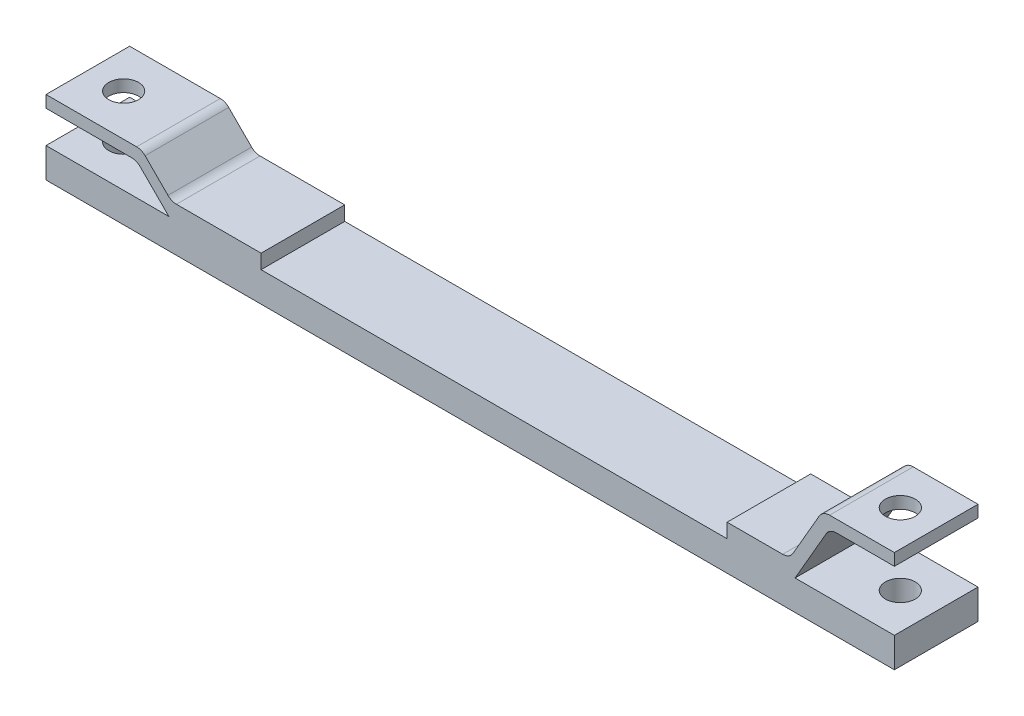
ISO-10303-21;
HEADER;
FILE_DESCRIPTION(('STEP AP214'),'2;1');
FILE_NAME('part.step','',(''),(''),'','','');
FILE_SCHEMA(('AUTOMOTIVE_DESIGN { 1 0 10303 214 1 1 1 1 }'));
ENDSEC;
DATA;
#1=APPLICATION_CONTEXT('core data for automotive mechanical design processes');
#2=APPLICATION_PROTOCOL_DEFINITION('international standard','automotive_design',2000,#1);
#3=PRODUCT_CONTEXT('',#1,'mechanical');
#4=PRODUCT('Part','Part','',(#3));
#5=PRODUCT_RELATED_PRODUCT_CATEGORY('part','',(#4));
#6=PRODUCT_DEFINITION_FORMATION('','',#4);
#7=PRODUCT_DEFINITION_CONTEXT('part definition',#1,'design');
#8=PRODUCT_DEFINITION('design','',#6,#7);
#9=PRODUCT_DEFINITION_SHAPE('','',#8);
#10=(LENGTH_UNIT() NAMED_UNIT(*) SI_UNIT(.MILLI.,.METRE.));
#11=(NAMED_UNIT(*) PLANE_ANGLE_UNIT() SI_UNIT($,.RADIAN.));
#12=(NAMED_UNIT(*) SI_UNIT($,.STERADIAN.) SOLID_ANGLE_UNIT());
#13=UNCERTAINTY_MEASURE_WITH_UNIT(LENGTH_MEASURE(1.E-05),#10,'distance_accuracy_value','');
#14=(GEOMETRIC_REPRESENTATION_CONTEXT(3) GLOBAL_UNCERTAINTY_ASSIGNED_CONTEXT((#13)) GLOBAL_UNIT_ASSIGNED_CONTEXT((#10,
#11,#12)) REPRESENTATION_CONTEXT('',''));
#15=CARTESIAN_POINT('',(0.,0.,0.));
#16=DIRECTION('',(0.,0.,1.));
#17=DIRECTION('',(1.,0.,0.));
#18=AXIS2_PLACEMENT_3D('',#15,#16,#17);
#19=CARTESIAN_POINT('',(459.354174376994,-265.208256229948,70.));
#20=DIRECTION('',(0.866025403784428,-0.500000000000018,0.));
#21=DIRECTION('',(0.500000000000018,0.866025403784428,0.));
#22=AXIS2_PLACEMENT_3D('',#19,#20,#21);
#23=PLANE('',#22);
#24=DIRECTION('',(-0.500000000000018,-0.866025403784428,0.));
#25=VECTOR('',#24,1.);
#26=CARTESIAN_POINT('',(459.354174376994,-265.208256229948,0.));
#27=LINE('',#26,#25);
#28=CARTESIAN_POINT('',(652.886751345949,70.0000000000003,0.));
#29=VERTEX_POINT('',#28);
#30=CARTESIAN_POINT('',(626.905989232414,25.,0.));
#31=VERTEX_POINT('',#30);
#32=EDGE_CURVE('E249',#29,#31,#27,.T.);
#33=ORIENTED_EDGE('',*,*,#32,.F.);
#34=DIRECTION('',(0.,0.,-1.));
#35=VECTOR('',#34,1.);
#36=CARTESIAN_POINT('',(652.886751345949,70.0000000000002,70.));
#37=LINE('',#36,#35);
#38=CARTESIAN_POINT('',(652.886751345949,70.0000000000003,70.));
#39=VERTEX_POINT('',#38);
#40=EDGE_CURVE('E363',#29,#39,#37,.F.);
#41=ORIENTED_EDGE('',*,*,#40,.T.);
#42=DIRECTION('',(-0.500000000000018,-0.866025403784428,0.));
#43=VECTOR('',#42,1.);
#44=CARTESIAN_POINT('',(459.354174376994,-265.208256229948,70.));
#45=LINE('',#44,#43);
#46=CARTESIAN_POINT('',(626.905989232414,25.,70.));
#47=VERTEX_POINT('',#46);
#48=EDGE_CURVE('E231',#39,#47,#45,.T.);
#49=ORIENTED_EDGE('',*,*,#48,.T.);
#50=DIRECTION('',(0.,0.,-1.));
#51=VECTOR('',#50,1.);
#52=CARTESIAN_POINT('',(626.905989232414,25.,70.));
#53=LINE('',#52,#51);
#54=EDGE_CURVE('E248',#47,#31,#53,.T.);
#55=ORIENTED_EDGE('',*,*,#54,.T.);
#56=EDGE_LOOP('',(#33,#41,#49,#55));
#57=FACE_BOUND('',#56,.T.);
#58=ADVANCED_FACE('F34',(#57),#23,.T.);
#59=CARTESIAN_POINT('',(0.,75.,70.));
#60=DIRECTION('',(0.,-1.,0.));
#61=DIRECTION('',(0.,0.,-1.));
#62=AXIS2_PLACEMENT_3D('',#59,#60,#61);
#63=PLANE('',#62);
#64=CARTESIAN_POINT('',(680.,75.,35.));
#65=DIRECTION('',(0.,-1.,0.));
#66=DIRECTION('',(0.,0.,-1.));
#67=AXIS2_PLACEMENT_3D('',#64,#65,#66);
#68=CIRCLE('',#67,12.5);
#69=CARTESIAN_POINT('',(680.,75.,22.5));
#70=VERTEX_POINT('',#69);
#71=EDGE_CURVE('E340',#70,#70,#68,.T.);
#72=ORIENTED_EDGE('',*,*,#71,.F.);
#73=EDGE_LOOP('',(#72));
#74=FACE_BOUND('',#73,.T.);
#75=DIRECTION('',(-1.,0.,0.));
#76=VECTOR('',#75,1.);
#77=CARTESIAN_POINT('',(0.,75.,70.));
#78=LINE('',#77,#76);
#79=CARTESIAN_POINT('',(710.,75.,70.));
#80=VERTEX_POINT('',#79);
#81=CARTESIAN_POINT('',(661.547005383793,75.,70.));
#82=VERTEX_POINT('',#81);
#83=EDGE_CURVE('E213',#80,#82,#78,.T.);
#84=ORIENTED_EDGE('',*,*,#83,.T.);
#85=DIRECTION('',(0.,0.,-1.));
#86=VECTOR('',#85,1.);
#87=CARTESIAN_POINT('',(661.547005383793,75.,0.));
#88=LINE('',#87,#86);
#89=CARTESIAN_POINT('',(661.547005383793,75.,0.));
#90=VERTEX_POINT('',#89);
#91=EDGE_CURVE('E361',#82,#90,#88,.T.);
#92=ORIENTED_EDGE('',*,*,#91,.T.);
#93=DIRECTION('',(-1.,0.,0.));
#94=VECTOR('',#93,1.);
#95=CARTESIAN_POINT('',(0.,75.,0.));
#96=LINE('',#95,#94);
#97=CARTESIAN_POINT('',(710.,75.,0.));
#98=VERTEX_POINT('',#97);
#99=EDGE_CURVE('E216',#98,#90,#96,.T.);
#100=ORIENTED_EDGE('',*,*,#99,.F.);
#101=DIRECTION('',(0.,0.,-1.));
#102=VECTOR('',#101,1.);
#103=CARTESIAN_POINT('',(710.,75.,70.));
#104=LINE('',#103,#102);
#105=EDGE_CURVE('E209',#80,#98,#104,.T.);
#106=ORIENTED_EDGE('',*,*,#105,.F.);
#107=EDGE_LOOP('',(#84,#92,#100,#106));
#108=FACE_BOUND('',#107,.T.);
#109=ADVANCED_FACE('F211',(#74,#108),#63,.T.);
#110=CARTESIAN_POINT('',(710.,0.,70.));
#111=DIRECTION('',(1.,0.,0.));
#112=DIRECTION('',(0.,0.,-1.));
#113=AXIS2_PLACEMENT_3D('',#110,#111,#112);
#114=PLANE('',#113);
#115=DIRECTION('',(0.,-1.,0.));
#116=VECTOR('',#115,1.);
#117=CARTESIAN_POINT('',(710.,0.,0.));
#118=LINE('',#117,#116);
#119=CARTESIAN_POINT('',(710.,85.,0.));
#120=VERTEX_POINT('',#119);
#121=EDGE_CURVE('E253',#120,#98,#118,.T.);
#122=ORIENTED_EDGE('',*,*,#121,.F.);
#123=DIRECTION('',(0.,0.,-1.));
#124=VECTOR('',#123,1.);
#125=CARTESIAN_POINT('',(710.,85.,70.));
#126=LINE('',#125,#124);
#127=CARTESIAN_POINT('',(710.,85.,70.));
#128=VERTEX_POINT('',#127);
#129=EDGE_CURVE('E222',#128,#120,#126,.T.);
#130=ORIENTED_EDGE('',*,*,#129,.F.);
#131=DIRECTION('',(0.,-1.,0.));
#132=VECTOR('',#131,1.);
#133=CARTESIAN_POINT('',(710.,0.,70.));
#134=LINE('',#133,#132);
#135=EDGE_CURVE('E227',#128,#80,#134,.T.);
#136=ORIENTED_EDGE('',*,*,#135,.T.);
#137=ORIENTED_EDGE('',*,*,#105,.T.);
#138=EDGE_LOOP('',(#122,#130,#136,#137));
#139=FACE_BOUND('',#138,.T.);
#140=ADVANCED_FACE('F233',(#139),#114,.T.);
#141=CARTESIAN_POINT('',(0.,84.9999999999997,70.));
#142=DIRECTION('',(0.,-1.,0.));
#143=DIRECTION('',(1.,0.,0.));
#144=AXIS2_PLACEMENT_3D('',#141,#142,#143);
#145=PLANE('',#144);
#146=CARTESIAN_POINT('',(680.,85.,35.));
#147=DIRECTION('',(0.,1.,0.));
#148=DIRECTION('',(-1.,0.,0.));
#149=AXIS2_PLACEMENT_3D('',#146,#147,#148);
#150=CIRCLE('',#149,12.5);
#151=CARTESIAN_POINT('',(667.5,85.,35.));
#152=VERTEX_POINT('',#151);
#153=EDGE_CURVE('E413',#152,#152,#150,.T.);
#154=ORIENTED_EDGE('',*,*,#153,.F.);
#155=EDGE_LOOP('',(#154));
#156=FACE_BOUND('',#155,.T.);
#157=DIRECTION('',(-1.,0.,0.));
#158=VECTOR('',#157,1.);
#159=CARTESIAN_POINT('',(0.,84.9999999999997,0.));
#160=LINE('',#159,#158);
#161=CARTESIAN_POINT('',(655.773502691896,85.,0.));
#162=VERTEX_POINT('',#161);
#163=EDGE_CURVE('E255',#120,#162,#160,.T.);
#164=ORIENTED_EDGE('',*,*,#163,.T.);
#165=DIRECTION('',(0.,0.,-1.));
#166=VECTOR('',#165,1.);
#167=CARTESIAN_POINT('',(655.773502691896,85.,70.));
#168=LINE('',#167,#166);
#169=CARTESIAN_POINT('',(655.773502691896,85.,70.));
#170=VERTEX_POINT('',#169);
#171=EDGE_CURVE('E377',#162,#170,#168,.F.);
#172=ORIENTED_EDGE('',*,*,#171,.T.);
#173=DIRECTION('',(-1.,0.,0.));
#174=VECTOR('',#173,1.);
#175=CARTESIAN_POINT('',(0.,84.9999999999997,70.));
#176=LINE('',#175,#174);
#177=EDGE_CURVE('E235',#128,#170,#176,.T.);
#178=ORIENTED_EDGE('',*,*,#177,.F.);
#179=ORIENTED_EDGE('',*,*,#129,.T.);
#180=EDGE_LOOP('',(#164,#172,#178,#179));
#181=FACE_BOUND('',#180,.T.);
#182=ADVANCED_FACE('F655',(#156,#181),#145,.F.);
#183=CARTESIAN_POINT('',(450.693920339159,-260.208256229944,70.));
#184=DIRECTION('',(0.866025403784436,-0.500000000000004,0.));
#185=DIRECTION('',(0.500000000000004,0.866025403784437,0.));
#186=AXIS2_PLACEMENT_3D('',#183,#184,#185);
#187=PLANE('',#186);
#188=DIRECTION('',(-0.500000000000004,-0.866025403784437,0.));
#189=VECTOR('',#188,1.);
#190=CARTESIAN_POINT('',(450.693920339159,-260.208256229944,0.));
#191=LINE('',#190,#189);
#192=CARTESIAN_POINT('',(647.113248654052,80.0000000000001,0.));
#193=VERTEX_POINT('',#192);
#194=CARTESIAN_POINT('',(625.173938424846,42.0000000000001,0.));
#195=VERTEX_POINT('',#194);
#196=EDGE_CURVE('E258',#193,#195,#191,.T.);
#197=ORIENTED_EDGE('',*,*,#196,.T.);
#198=DIRECTION('',(0.,0.,-1.));
#199=VECTOR('',#198,1.);
#200=CARTESIAN_POINT('',(625.173938424846,42.,70.));
#201=LINE('',#200,#199);
#202=CARTESIAN_POINT('',(625.173938424846,42.0000000000001,70.));
#203=VERTEX_POINT('',#202);
#204=EDGE_CURVE('E371',#195,#203,#201,.F.);
#205=ORIENTED_EDGE('',*,*,#204,.T.);
#206=DIRECTION('',(-0.500000000000004,-0.866025403784437,0.));
#207=VECTOR('',#206,1.);
#208=CARTESIAN_POINT('',(450.693920339159,-260.208256229944,70.));
#209=LINE('',#208,#207);
#210=CARTESIAN_POINT('',(647.113248654052,80.0000000000001,70.));
#211=VERTEX_POINT('',#210);
#212=EDGE_CURVE('E237',#211,#203,#209,.T.);
#213=ORIENTED_EDGE('',*,*,#212,.F.);
#214=DIRECTION('',(0.,0.,-1.));
#215=VECTOR('',#214,1.);
#216=CARTESIAN_POINT('',(647.113248654052,80.,70.));
#217=LINE('',#216,#215);
#218=EDGE_CURVE('E368',#211,#193,#217,.T.);
#219=ORIENTED_EDGE('',*,*,#218,.T.);
#220=EDGE_LOOP('',(#197,#205,#213,#219));
#221=FACE_BOUND('',#220,.T.);
#222=ADVANCED_FACE('F649',(#221),#187,.F.);
#223=CARTESIAN_POINT('',(0.,36.9999999999999,70.));
#224=DIRECTION('',(0.,-1.,0.));
#225=DIRECTION('',(1.,0.,0.));
#226=AXIS2_PLACEMENT_3D('',#223,#224,#225);
#227=PLANE('',#226);
#228=DIRECTION('',(-1.,0.,0.));
#229=VECTOR('',#228,1.);
#230=CARTESIAN_POINT('',(0.,36.9999999999999,70.));
#231=LINE('',#230,#229);
#232=CARTESIAN_POINT('',(616.513684387001,37.,70.));
#233=VERTEX_POINT('',#232);
#234=CARTESIAN_POINT('',(570.,37.,70.));
#235=VERTEX_POINT('',#234);
#236=EDGE_CURVE('E243',#233,#235,#231,.T.);
#237=ORIENTED_EDGE('',*,*,#236,.F.);
#238=DIRECTION('',(0.,0.,-1.));
#239=VECTOR('',#238,1.);
#240=CARTESIAN_POINT('',(616.513684387001,37.,0.));
#241=LINE('',#240,#239);
#242=CARTESIAN_POINT('',(616.513684387001,37.,0.));
#243=VERTEX_POINT('',#242);
#244=EDGE_CURVE('E365',#233,#243,#241,.T.);
#245=ORIENTED_EDGE('',*,*,#244,.T.);
#246=DIRECTION('',(-1.,0.,0.));
#247=VECTOR('',#246,1.);
#248=CARTESIAN_POINT('',(0.,36.9999999999999,0.));
#249=LINE('',#248,#247);
#250=CARTESIAN_POINT('',(570.,37.,0.));
#251=VERTEX_POINT('',#250);
#252=EDGE_CURVE('E261',#243,#251,#249,.T.);
#253=ORIENTED_EDGE('',*,*,#252,.T.);
#254=DIRECTION('',(0.,0.,-1.));
#255=VECTOR('',#254,1.);
#256=CARTESIAN_POINT('',(570.,37.,70.));
#257=LINE('',#256,#255);
#258=EDGE_CURVE('E270',#235,#251,#257,.T.);
#259=ORIENTED_EDGE('',*,*,#258,.F.);
#260=EDGE_LOOP('',(#237,#245,#253,#259));
#261=FACE_BOUND('',#260,.T.);
#262=ADVANCED_FACE('F654',(#261),#227,.F.);
#263=CARTESIAN_POINT('',(570.,0.,70.));
#264=DIRECTION('',(1.,0.,0.));
#265=DIRECTION('',(0.,0.,-1.));
#266=AXIS2_PLACEMENT_3D('',#263,#264,#265);
#267=PLANE('',#266);
#268=DIRECTION('',(0.,-1.,0.));
#269=VECTOR('',#268,1.);
#270=CARTESIAN_POINT('',(570.,0.,0.));
#271=LINE('',#270,#269);
#272=CARTESIAN_POINT('',(570.,25.,0.));
#273=VERTEX_POINT('',#272);
#274=EDGE_CURVE('E263',#251,#273,#271,.T.);
#275=ORIENTED_EDGE('',*,*,#274,.T.);
#276=DIRECTION('',(0.,0.,-1.));
#277=VECTOR('',#276,1.);
#278=CARTESIAN_POINT('',(570.,25.,70.));
#279=LINE('',#278,#277);
#280=CARTESIAN_POINT('',(570.,25.,70.));
#281=VERTEX_POINT('',#280);
#282=EDGE_CURVE('E268',#281,#273,#279,.T.);
#283=ORIENTED_EDGE('',*,*,#282,.F.);
#284=DIRECTION('',(0.,-1.,0.));
#285=VECTOR('',#284,1.);
#286=CARTESIAN_POINT('',(570.,0.,70.));
#287=LINE('',#286,#285);
#288=EDGE_CURVE('E245',#235,#281,#287,.T.);
#289=ORIENTED_EDGE('',*,*,#288,.F.);
#290=ORIENTED_EDGE('',*,*,#258,.T.);
#291=EDGE_LOOP('',(#275,#283,#289,#290));
#292=FACE_BOUND('',#291,.T.);
#293=ADVANCED_FACE('F447',(#292),#267,.F.);
#294=CARTESIAN_POINT('',(0.,0.,70.));
#295=DIRECTION('',(0.,0.,1.));
#296=DIRECTION('',(1.,0.,0.));
#297=AXIS2_PLACEMENT_3D('',#294,#295,#296);
#298=PLANE('',#297);
#299=ORIENTED_EDGE('',*,*,#177,.T.);
#300=CARTESIAN_POINT('',(655.773502691896,75.,70.));
#301=DIRECTION('',(0.,0.,1.));
#302=DIRECTION('',(1.,0.,0.));
#303=AXIS2_PLACEMENT_3D('',#300,#301,#302);
#304=CIRCLE('',#303,10.);
#305=EDGE_CURVE('E380',#170,#211,#304,.T.);
#306=ORIENTED_EDGE('',*,*,#305,.T.);
#307=ORIENTED_EDGE('',*,*,#212,.T.);
#308=CARTESIAN_POINT('',(616.513684387001,47.,70.));
#309=DIRECTION('',(0.,0.,1.));
#310=DIRECTION('',(1.,0.,0.));
#311=AXIS2_PLACEMENT_3D('',#308,#309,#310);
#312=CIRCLE('',#311,10.);
#313=EDGE_CURVE('E401',#203,#233,#312,.F.);
#314=ORIENTED_EDGE('',*,*,#313,.T.);
#315=ORIENTED_EDGE('',*,*,#236,.T.);
#316=ORIENTED_EDGE('',*,*,#288,.T.);
#317=DIRECTION('',(1.,0.,0.));
#318=VECTOR('',#317,1.);
#319=CARTESIAN_POINT('',(0.,25.,70.));
#320=LINE('',#319,#318);
#321=CARTESIAN_POINT('',(180.,25.,70.));
#322=VERTEX_POINT('',#321);
#323=EDGE_CURVE('E330',#322,#281,#320,.T.);
#324=ORIENTED_EDGE('',*,*,#323,.F.);
#325=DIRECTION('',(0.,-1.,0.));
#326=VECTOR('',#325,1.);
#327=CARTESIAN_POINT('',(180.,0.,70.));
#328=LINE('',#327,#326);
#329=CARTESIAN_POINT('',(180.,37.,70.));
#330=VERTEX_POINT('',#329);
#331=EDGE_CURVE('E274',#330,#322,#328,.T.);
#332=ORIENTED_EDGE('',*,*,#331,.F.);
#333=DIRECTION('',(1.,0.,0.));
#334=VECTOR('',#333,1.);
#335=CARTESIAN_POINT('',(0.,37.,70.));
#336=LINE('',#335,#334);
#337=CARTESIAN_POINT('',(109.142135623731,37.,70.));
#338=VERTEX_POINT('',#337);
#339=EDGE_CURVE('E277',#338,#330,#336,.T.);
#340=ORIENTED_EDGE('',*,*,#339,.F.);
#341=CARTESIAN_POINT('',(109.142135623731,47.,70.));
#342=DIRECTION('',(0.,0.,1.));
#343=DIRECTION('',(1.,0.,0.));
#344=AXIS2_PLACEMENT_3D('',#341,#342,#343);
#345=CIRCLE('',#344,10.);
#346=CARTESIAN_POINT('',(102.071067811865,39.9289321881345,70.));
#347=VERTEX_POINT('',#346);
#348=EDGE_CURVE('E11',#338,#347,#345,.F.);
#349=ORIENTED_EDGE('',*,*,#348,.T.);
#350=DIRECTION('',(0.707106781186546,-0.707106781186549,0.));
#351=VECTOR('',#350,1.);
#352=CARTESIAN_POINT('',(71.0000000000001,70.9999999999999,70.));
#353=LINE('',#352,#351);
#354=CARTESIAN_POINT('',(82.9289321881345,59.0710678118655,70.));
#355=VERTEX_POINT('',#354);
#356=EDGE_CURVE('E280',#355,#347,#353,.T.);
#357=ORIENTED_EDGE('',*,*,#356,.F.);
#358=CARTESIAN_POINT('',(75.857864376269,52.,70.));
#359=DIRECTION('',(0.,0.,1.));
#360=DIRECTION('',(1.,0.,0.));
#361=AXIS2_PLACEMENT_3D('',#358,#359,#360);
#362=CIRCLE('',#361,10.);
#363=CARTESIAN_POINT('',(75.857864376269,62.,70.));
#364=VERTEX_POINT('',#363);
#365=EDGE_CURVE('E51',#355,#364,#362,.T.);
#366=ORIENTED_EDGE('',*,*,#365,.T.);
#367=DIRECTION('',(1.,0.,0.));
#368=VECTOR('',#367,1.);
#369=CARTESIAN_POINT('',(0.,62.,70.));
#370=LINE('',#369,#368);
#371=CARTESIAN_POINT('',(0.,62.,70.));
#372=VERTEX_POINT('',#371);
#373=EDGE_CURVE('E282',#372,#364,#370,.T.);
#374=ORIENTED_EDGE('',*,*,#373,.F.);
#375=DIRECTION('',(0.,-1.,0.));
#376=VECTOR('',#375,1.);
#377=CARTESIAN_POINT('',(0.,0.,70.));
#378=LINE('',#377,#376);
#379=CARTESIAN_POINT('',(0.,52.,70.));
#380=VERTEX_POINT('',#379);
#381=EDGE_CURVE('E284',#372,#380,#378,.T.);
#382=ORIENTED_EDGE('',*,*,#381,.T.);
#383=DIRECTION('',(1.,0.,0.));
#384=VECTOR('',#383,1.);
#385=CARTESIAN_POINT('',(0.,52.,70.));
#386=LINE('',#385,#384);
#387=CARTESIAN_POINT('',(71.7157287525381,52.,70.));
#388=VERTEX_POINT('',#387);
#389=EDGE_CURVE('E286',#380,#388,#386,.T.);
#390=ORIENTED_EDGE('',*,*,#389,.T.);
#391=CARTESIAN_POINT('',(71.7157287525381,42.,70.));
#392=DIRECTION('',(0.,0.,1.));
#393=DIRECTION('',(1.,0.,0.));
#394=AXIS2_PLACEMENT_3D('',#391,#392,#393);
#395=CIRCLE('',#394,10.);
#396=CARTESIAN_POINT('',(78.7867965644036,49.0710678118655,70.));
#397=VERTEX_POINT('',#396);
#398=EDGE_CURVE('E394',#388,#397,#395,.F.);
#399=ORIENTED_EDGE('',*,*,#398,.T.);
#400=DIRECTION('',(0.707106781186548,-0.707106781186547,0.));
#401=VECTOR('',#400,1.);
#402=CARTESIAN_POINT('',(63.9289321881345,63.9289321881345,70.));
#403=LINE('',#402,#401);
#404=CARTESIAN_POINT('',(102.857864376269,25.,70.));
#405=VERTEX_POINT('',#404);
#406=EDGE_CURVE('E289',#397,#405,#403,.T.);
#407=ORIENTED_EDGE('',*,*,#406,.T.);
#408=CARTESIAN_POINT('',(0.,25.,70.));
#409=VERTEX_POINT('',#408);
#410=EDGE_CURVE('E326',#409,#405,#320,.T.);
#411=ORIENTED_EDGE('',*,*,#410,.F.);
#412=DIRECTION('',(0.,1.,0.));
#413=VECTOR('',#412,1.);
#414=CARTESIAN_POINT('',(0.,0.,70.));
#415=LINE('',#414,#413);
#416=CARTESIAN_POINT('',(0.,0.,70.));
#417=VERTEX_POINT('',#416);
#418=EDGE_CURVE('E321',#417,#409,#415,.T.);
#419=ORIENTED_EDGE('',*,*,#418,.F.);
#420=DIRECTION('',(1.,0.,0.));
#421=VECTOR('',#420,1.);
#422=CARTESIAN_POINT('',(0.,0.,70.));
#423=LINE('',#422,#421);
#424=CARTESIAN_POINT('',(710.,0.,70.));
#425=VERTEX_POINT('',#424);
#426=EDGE_CURVE('E333',#417,#425,#423,.T.);
#427=ORIENTED_EDGE('',*,*,#426,.T.);
#428=DIRECTION('',(0.,1.,0.));
#429=VECTOR('',#428,1.);
#430=CARTESIAN_POINT('',(710.,0.,70.));
#431=LINE('',#430,#429);
#432=CARTESIAN_POINT('',(710.,25.,70.));
#433=VERTEX_POINT('',#432);
#434=EDGE_CURVE('E329',#425,#433,#431,.T.);
#435=ORIENTED_EDGE('',*,*,#434,.T.);
#436=EDGE_CURVE('E324',#47,#433,#320,.T.);
#437=ORIENTED_EDGE('',*,*,#436,.F.);
#438=ORIENTED_EDGE('',*,*,#48,.F.);
#439=CARTESIAN_POINT('',(661.547005383793,65.,70.));
#440=DIRECTION('',(0.,0.,1.));
#441=DIRECTION('',(1.,0.,0.));
#442=AXIS2_PLACEMENT_3D('',#439,#440,#441);
#443=CIRCLE('',#442,10.);
#444=EDGE_CURVE('E230',#39,#82,#443,.F.);
#445=ORIENTED_EDGE('',*,*,#444,.T.);
#446=ORIENTED_EDGE('',*,*,#83,.F.);
#447=ORIENTED_EDGE('',*,*,#135,.F.);
#448=EDGE_LOOP('',(#299,#306,#307,#314,#315,#316,#324,#332,#340,#349,#357,#366,#374,#382,#390,
#399,#407,#411,#419,#427,#435,#437,#438,#445,#446,#447));
#449=FACE_BOUND('',#448,.T.);
#450=ADVANCED_FACE('F226',(#449),#298,.T.);
#451=CARTESIAN_POINT('',(0.,0.,0.));
#452=DIRECTION('',(0.,0.,1.));
#453=DIRECTION('',(1.,0.,0.));
#454=AXIS2_PLACEMENT_3D('',#451,#452,#453);
#455=PLANE('',#454);
#456=ORIENTED_EDGE('',*,*,#196,.F.);
#457=CARTESIAN_POINT('',(655.773502691896,75.,0.));
#458=DIRECTION('',(0.,0.,1.));
#459=DIRECTION('',(1.,0.,0.));
#460=AXIS2_PLACEMENT_3D('',#457,#458,#459);
#461=CIRCLE('',#460,10.);
#462=EDGE_CURVE('E375',#193,#162,#461,.F.);
#463=ORIENTED_EDGE('',*,*,#462,.T.);
#464=ORIENTED_EDGE('',*,*,#163,.F.);
#465=ORIENTED_EDGE('',*,*,#121,.T.);
#466=ORIENTED_EDGE('',*,*,#99,.T.);
#467=CARTESIAN_POINT('',(661.547005383793,65.,0.));
#468=DIRECTION('',(0.,0.,1.));
#469=DIRECTION('',(1.,0.,0.));
#470=AXIS2_PLACEMENT_3D('',#467,#468,#469);
#471=CIRCLE('',#470,10.);
#472=EDGE_CURVE('E396',#90,#29,#471,.T.);
#473=ORIENTED_EDGE('',*,*,#472,.T.);
#474=ORIENTED_EDGE('',*,*,#32,.T.);
#475=DIRECTION('',(1.,0.,0.));
#476=VECTOR('',#475,1.);
#477=CARTESIAN_POINT('',(0.,25.,0.));
#478=LINE('',#477,#476);
#479=CARTESIAN_POINT('',(710.,25.,0.));
#480=VERTEX_POINT('',#479);
#481=EDGE_CURVE('E339',#31,#480,#478,.T.);
#482=ORIENTED_EDGE('',*,*,#481,.T.);
#483=DIRECTION('',(0.,1.,0.));
#484=VECTOR('',#483,1.);
#485=CARTESIAN_POINT('',(710.,0.,0.));
#486=LINE('',#485,#484);
#487=CARTESIAN_POINT('',(710.,0.,0.));
#488=VERTEX_POINT('',#487);
#489=EDGE_CURVE('E344',#488,#480,#486,.T.);
#490=ORIENTED_EDGE('',*,*,#489,.F.);
#491=DIRECTION('',(1.,0.,0.));
#492=VECTOR('',#491,1.);
#493=CARTESIAN_POINT('',(0.,0.,0.));
#494=LINE('',#493,#492);
#495=CARTESIAN_POINT('',(0.,0.,0.));
#496=VERTEX_POINT('',#495);
#497=EDGE_CURVE('E325',#496,#488,#494,.T.);
#498=ORIENTED_EDGE('',*,*,#497,.F.);
#499=DIRECTION('',(0.,1.,0.));
#500=VECTOR('',#499,1.);
#501=CARTESIAN_POINT('',(0.,0.,0.));
#502=LINE('',#501,#500);
#503=CARTESIAN_POINT('',(0.,25.,0.));
#504=VERTEX_POINT('',#503);
#505=EDGE_CURVE('E336',#496,#504,#502,.T.);
#506=ORIENTED_EDGE('',*,*,#505,.T.);
#507=CARTESIAN_POINT('',(102.857864376269,25.,0.));
#508=VERTEX_POINT('',#507);
#509=EDGE_CURVE('E341',#504,#508,#478,.T.);
#510=ORIENTED_EDGE('',*,*,#509,.T.);
#511=DIRECTION('',(0.707106781186548,-0.707106781186547,0.));
#512=VECTOR('',#511,1.);
#513=CARTESIAN_POINT('',(63.9289321881345,63.9289321881345,0.));
#514=LINE('',#513,#512);
#515=CARTESIAN_POINT('',(78.7867965644036,49.0710678118655,0.));
#516=VERTEX_POINT('',#515);
#517=EDGE_CURVE('E278',#516,#508,#514,.T.);
#518=ORIENTED_EDGE('',*,*,#517,.F.);
#519=CARTESIAN_POINT('',(71.7157287525381,42.,0.));
#520=DIRECTION('',(0.,0.,1.));
#521=DIRECTION('',(1.,0.,0.));
#522=AXIS2_PLACEMENT_3D('',#519,#520,#521);
#523=CIRCLE('',#522,10.);
#524=CARTESIAN_POINT('',(71.7157287525381,52.,0.));
#525=VERTEX_POINT('',#524);
#526=EDGE_CURVE('E392',#516,#525,#523,.T.);
#527=ORIENTED_EDGE('',*,*,#526,.T.);
#528=DIRECTION('',(1.,0.,0.));
#529=VECTOR('',#528,1.);
#530=CARTESIAN_POINT('',(0.,52.,0.));
#531=LINE('',#530,#529);
#532=CARTESIAN_POINT('',(0.,52.,0.));
#533=VERTEX_POINT('',#532);
#534=EDGE_CURVE('E306',#533,#525,#531,.T.);
#535=ORIENTED_EDGE('',*,*,#534,.F.);
#536=DIRECTION('',(0.,-1.,0.));
#537=VECTOR('',#536,1.);
#538=CARTESIAN_POINT('',(0.,0.,0.));
#539=LINE('',#538,#537);
#540=CARTESIAN_POINT('',(0.,62.,0.));
#541=VERTEX_POINT('',#540);
#542=EDGE_CURVE('E304',#541,#533,#539,.T.);
#543=ORIENTED_EDGE('',*,*,#542,.F.);
#544=DIRECTION('',(1.,0.,0.));
#545=VECTOR('',#544,1.);
#546=CARTESIAN_POINT('',(0.,62.,0.));
#547=LINE('',#546,#545);
#548=CARTESIAN_POINT('',(75.857864376269,62.,0.));
#549=VERTEX_POINT('',#548);
#550=EDGE_CURVE('E301',#541,#549,#547,.T.);
#551=ORIENTED_EDGE('',*,*,#550,.T.);
#552=CARTESIAN_POINT('',(75.857864376269,52.,0.));
#553=DIRECTION('',(0.,0.,1.));
#554=DIRECTION('',(1.,0.,0.));
#555=AXIS2_PLACEMENT_3D('',#552,#553,#554);
#556=CIRCLE('',#555,10.);
#557=CARTESIAN_POINT('',(82.9289321881345,59.0710678118655,0.));
#558=VERTEX_POINT('',#557);
#559=EDGE_CURVE('E373',#549,#558,#556,.F.);
#560=ORIENTED_EDGE('',*,*,#559,.T.);
#561=DIRECTION('',(0.707106781186546,-0.707106781186549,0.));
#562=VECTOR('',#561,1.);
#563=CARTESIAN_POINT('',(71.0000000000001,70.9999999999999,0.));
#564=LINE('',#563,#562);
#565=CARTESIAN_POINT('',(102.071067811865,39.9289321881345,0.));
#566=VERTEX_POINT('',#565);
#567=EDGE_CURVE('E298',#558,#566,#564,.T.);
#568=ORIENTED_EDGE('',*,*,#567,.T.);
#569=CARTESIAN_POINT('',(109.142135623731,47.,0.));
#570=DIRECTION('',(0.,0.,1.));
#571=DIRECTION('',(1.,0.,0.));
#572=AXIS2_PLACEMENT_3D('',#569,#570,#571);
#573=CIRCLE('',#572,10.);
#574=CARTESIAN_POINT('',(109.142135623731,37.,0.));
#575=VERTEX_POINT('',#574);
#576=EDGE_CURVE('E43',#566,#575,#573,.T.);
#577=ORIENTED_EDGE('',*,*,#576,.T.);
#578=DIRECTION('',(1.,0.,0.));
#579=VECTOR('',#578,1.);
#580=CARTESIAN_POINT('',(0.,37.,0.));
#581=LINE('',#580,#579);
#582=CARTESIAN_POINT('',(180.,37.,0.));
#583=VERTEX_POINT('',#582);
#584=EDGE_CURVE('E295',#575,#583,#581,.T.);
#585=ORIENTED_EDGE('',*,*,#584,.T.);
#586=DIRECTION('',(0.,-1.,0.));
#587=VECTOR('',#586,1.);
#588=CARTESIAN_POINT('',(180.,0.,0.));
#589=LINE('',#588,#587);
#590=CARTESIAN_POINT('',(180.,25.,0.));
#591=VERTEX_POINT('',#590);
#592=EDGE_CURVE('E292',#583,#591,#589,.T.);
#593=ORIENTED_EDGE('',*,*,#592,.T.);
#594=EDGE_CURVE('E345',#591,#273,#478,.T.);
#595=ORIENTED_EDGE('',*,*,#594,.T.);
#596=ORIENTED_EDGE('',*,*,#274,.F.);
#597=ORIENTED_EDGE('',*,*,#252,.F.);
#598=CARTESIAN_POINT('',(616.513684387001,47.,0.));
#599=DIRECTION('',(0.,0.,1.));
#600=DIRECTION('',(1.,0.,0.));
#601=AXIS2_PLACEMENT_3D('',#598,#599,#600);
#602=CIRCLE('',#601,10.);
#603=EDGE_CURVE('E399',#243,#195,#602,.T.);
#604=ORIENTED_EDGE('',*,*,#603,.T.);
#605=EDGE_LOOP('',(#456,#463,#464,#465,#466,#473,#474,#482,#490,#498,#506,#510,#518,#527,#535,
#543,#551,#560,#568,#577,#585,#593,#595,#596,#597,#604));
#606=FACE_BOUND('',#605,.T.);
#607=ADVANCED_FACE('F452',(#606),#455,.F.);
#608=CARTESIAN_POINT('',(0.,37.,70.));
#609=DIRECTION('',(0.,1.,0.));
#610=DIRECTION('',(0.,0.,1.));
#611=AXIS2_PLACEMENT_3D('',#608,#609,#610);
#612=PLANE('',#611);
#613=ORIENTED_EDGE('',*,*,#584,.F.);
#614=DIRECTION('',(0.,0.,-1.));
#615=VECTOR('',#614,1.);
#616=CARTESIAN_POINT('',(109.142135623731,37.,70.));
#617=LINE('',#616,#615);
#618=EDGE_CURVE('E387',#575,#338,#617,.F.);
#619=ORIENTED_EDGE('',*,*,#618,.T.);
#620=ORIENTED_EDGE('',*,*,#339,.T.);
#621=DIRECTION('',(0.,0.,-1.));
#622=VECTOR('',#621,1.);
#623=CARTESIAN_POINT('',(180.,37.,70.));
#624=LINE('',#623,#622);
#625=EDGE_CURVE('E317',#330,#583,#624,.T.);
#626=ORIENTED_EDGE('',*,*,#625,.T.);
#627=EDGE_LOOP('',(#613,#619,#620,#626));
#628=FACE_BOUND('',#627,.T.);
#629=ADVANCED_FACE('F504',(#628),#612,.T.);
#630=CARTESIAN_POINT('',(71.0000000000001,70.9999999999999,70.));
#631=DIRECTION('',(0.707106781186549,0.707106781186546,0.));
#632=DIRECTION('',(-0.707106781186546,0.707106781186549,0.));
#633=AXIS2_PLACEMENT_3D('',#630,#631,#632);
#634=PLANE('',#633);
#635=ORIENTED_EDGE('',*,*,#356,.T.);
#636=DIRECTION('',(0.,0.,-1.));
#637=VECTOR('',#636,1.);
#638=CARTESIAN_POINT('',(102.071067811865,39.9289321881345,0.));
#639=LINE('',#638,#637);
#640=EDGE_CURVE('E384',#347,#566,#639,.T.);
#641=ORIENTED_EDGE('',*,*,#640,.T.);
#642=ORIENTED_EDGE('',*,*,#567,.F.);
#643=DIRECTION('',(0.,0.,-1.));
#644=VECTOR('',#643,1.);
#645=CARTESIAN_POINT('',(82.9289321881345,59.0710678118655,70.));
#646=LINE('',#645,#644);
#647=EDGE_CURVE('E382',#558,#355,#646,.F.);
#648=ORIENTED_EDGE('',*,*,#647,.T.);
#649=EDGE_LOOP('',(#635,#641,#642,#648));
#650=FACE_BOUND('',#649,.T.);
#651=ADVANCED_FACE('F497',(#650),#634,.T.);
#652=CARTESIAN_POINT('',(0.,62.,70.));
#653=DIRECTION('',(0.,1.,0.));
#654=DIRECTION('',(0.,0.,1.));
#655=AXIS2_PLACEMENT_3D('',#652,#653,#654);
#656=PLANE('',#655);
#657=CARTESIAN_POINT('',(30.,62.,35.));
#658=DIRECTION('',(0.,1.,0.));
#659=DIRECTION('',(0.,0.,1.));
#660=AXIS2_PLACEMENT_3D('',#657,#658,#659);
#661=CIRCLE('',#660,12.5);
#662=CARTESIAN_POINT('',(30.,62.,47.5));
#663=VERTEX_POINT('',#662);
#664=EDGE_CURVE('E410',#663,#663,#661,.T.);
#665=ORIENTED_EDGE('',*,*,#664,.F.);
#666=EDGE_LOOP('',(#665));
#667=FACE_BOUND('',#666,.T.);
#668=ORIENTED_EDGE('',*,*,#373,.T.);
#669=DIRECTION('',(0.,0.,-1.));
#670=VECTOR('',#669,1.);
#671=CARTESIAN_POINT('',(75.857864376269,62.,70.));
#672=LINE('',#671,#670);
#673=EDGE_CURVE('E389',#364,#549,#672,.T.);
#674=ORIENTED_EDGE('',*,*,#673,.T.);
#675=ORIENTED_EDGE('',*,*,#550,.F.);
#676=DIRECTION('',(0.,0.,-1.));
#677=VECTOR('',#676,1.);
#678=CARTESIAN_POINT('',(0.,62.,70.));
#679=LINE('',#678,#677);
#680=EDGE_CURVE('E315',#372,#541,#679,.T.);
#681=ORIENTED_EDGE('',*,*,#680,.F.);
#682=EDGE_LOOP('',(#668,#674,#675,#681));
#683=FACE_BOUND('',#682,.T.);
#684=ADVANCED_FACE('F491',(#667,#683),#656,.T.);
#685=CARTESIAN_POINT('',(0.,0.,70.));
#686=DIRECTION('',(1.,0.,0.));
#687=DIRECTION('',(0.,0.,-1.));
#688=AXIS2_PLACEMENT_3D('',#685,#686,#687);
#689=PLANE('',#688);
#690=ORIENTED_EDGE('',*,*,#542,.T.);
#691=DIRECTION('',(0.,0.,-1.));
#692=VECTOR('',#691,1.);
#693=CARTESIAN_POINT('',(0.,52.,70.));
#694=LINE('',#693,#692);
#695=EDGE_CURVE('E312',#380,#533,#694,.T.);
#696=ORIENTED_EDGE('',*,*,#695,.F.);
#697=ORIENTED_EDGE('',*,*,#381,.F.);
#698=ORIENTED_EDGE('',*,*,#680,.T.);
#699=EDGE_LOOP('',(#690,#696,#697,#698));
#700=FACE_BOUND('',#699,.T.);
#701=ADVANCED_FACE('F487',(#700),#689,.F.);
#702=CARTESIAN_POINT('',(0.,52.,70.));
#703=DIRECTION('',(0.,1.,0.));
#704=DIRECTION('',(0.,0.,1.));
#705=AXIS2_PLACEMENT_3D('',#702,#703,#704);
#706=PLANE('',#705);
#707=CARTESIAN_POINT('',(30.,52.,35.));
#708=DIRECTION('',(0.,1.,0.));
#709=DIRECTION('',(0.,0.,1.));
#710=AXIS2_PLACEMENT_3D('',#707,#708,#709);
#711=CIRCLE('',#710,12.5);
#712=CARTESIAN_POINT('',(30.,52.,47.5));
#713=VERTEX_POINT('',#712);
#714=EDGE_CURVE('E405',#713,#713,#711,.T.);
#715=ORIENTED_EDGE('',*,*,#714,.T.);
#716=EDGE_LOOP('',(#715));
#717=FACE_BOUND('',#716,.T.);
#718=ORIENTED_EDGE('',*,*,#534,.T.);
#719=DIRECTION('',(0.,0.,-1.));
#720=VECTOR('',#719,1.);
#721=CARTESIAN_POINT('',(71.7157287525381,52.,70.));
#722=LINE('',#721,#720);
#723=EDGE_CURVE('E359',#525,#388,#722,.F.);
#724=ORIENTED_EDGE('',*,*,#723,.T.);
#725=ORIENTED_EDGE('',*,*,#389,.F.);
#726=ORIENTED_EDGE('',*,*,#695,.T.);
#727=EDGE_LOOP('',(#718,#724,#725,#726));
#728=FACE_BOUND('',#727,.T.);
#729=ADVANCED_FACE('F483',(#717,#728),#706,.F.);
#730=CARTESIAN_POINT('',(63.9289321881345,63.9289321881345,70.));
#731=DIRECTION('',(0.707106781186547,0.707106781186548,0.));
#732=DIRECTION('',(-0.707106781186548,0.707106781186547,0.));
#733=AXIS2_PLACEMENT_3D('',#730,#731,#732);
#734=PLANE('',#733);
#735=ORIENTED_EDGE('',*,*,#406,.F.);
#736=DIRECTION('',(0.,0.,-1.));
#737=VECTOR('',#736,1.);
#738=CARTESIAN_POINT('',(78.7867965644036,49.0710678118655,0.));
#739=LINE('',#738,#737);
#740=EDGE_CURVE('E221',#397,#516,#739,.T.);
#741=ORIENTED_EDGE('',*,*,#740,.T.);
#742=ORIENTED_EDGE('',*,*,#517,.T.);
#743=DIRECTION('',(0.,0.,-1.));
#744=VECTOR('',#743,1.);
#745=CARTESIAN_POINT('',(102.857864376269,25.,70.));
#746=LINE('',#745,#744);
#747=EDGE_CURVE('E291',#405,#508,#746,.T.);
#748=ORIENTED_EDGE('',*,*,#747,.F.);
#749=EDGE_LOOP('',(#735,#741,#742,#748));
#750=FACE_BOUND('',#749,.T.);
#751=ADVANCED_FACE('F475',(#750),#734,.F.);
#752=CARTESIAN_POINT('',(180.,0.,70.));
#753=DIRECTION('',(1.,0.,0.));
#754=DIRECTION('',(0.,0.,-1.));
#755=AXIS2_PLACEMENT_3D('',#752,#753,#754);
#756=PLANE('',#755);
#757=ORIENTED_EDGE('',*,*,#592,.F.);
#758=ORIENTED_EDGE('',*,*,#625,.F.);
#759=ORIENTED_EDGE('',*,*,#331,.T.);
#760=DIRECTION('',(0.,0.,-1.));
#761=VECTOR('',#760,1.);
#762=CARTESIAN_POINT('',(180.,25.,70.));
#763=LINE('',#762,#761);
#764=EDGE_CURVE('E251',#322,#591,#763,.T.);
#765=ORIENTED_EDGE('',*,*,#764,.T.);
#766=EDGE_LOOP('',(#757,#758,#759,#765));
#767=FACE_BOUND('',#766,.T.);
#768=ADVANCED_FACE('F507',(#767),#756,.T.);
#769=CARTESIAN_POINT('',(0.,0.,70.));
#770=DIRECTION('',(0.,1.,0.));
#771=DIRECTION('',(0.,0.,1.));
#772=AXIS2_PLACEMENT_3D('',#769,#770,#771);
#773=PLANE('',#772);
#774=CARTESIAN_POINT('',(680.,0.,35.));
#775=DIRECTION('',(0.,1.,0.));
#776=DIRECTION('',(-1.,0.,0.));
#777=AXIS2_PLACEMENT_3D('',#774,#775,#776);
#778=CIRCLE('',#777,12.5);
#779=CARTESIAN_POINT('',(667.5,0.,35.));
#780=VERTEX_POINT('',#779);
#781=EDGE_CURVE('E406',#780,#780,#778,.T.);
#782=ORIENTED_EDGE('',*,*,#781,.T.);
#783=EDGE_LOOP('',(#782));
#784=FACE_BOUND('',#783,.T.);
#785=CARTESIAN_POINT('',(30.,-3.19189119579733E-13,35.));
#786=DIRECTION('',(0.,1.,0.));
#787=DIRECTION('',(-1.,0.,0.));
#788=AXIS2_PLACEMENT_3D('',#785,#786,#787);
#789=CIRCLE('',#788,12.5);
#790=CARTESIAN_POINT('',(17.5,-3.24971531166322E-13,35.));
#791=VERTEX_POINT('',#790);
#792=EDGE_CURVE('E418',#791,#791,#789,.T.);
#793=ORIENTED_EDGE('',*,*,#792,.T.);
#794=EDGE_LOOP('',(#793));
#795=FACE_BOUND('',#794,.T.);
#796=ORIENTED_EDGE('',*,*,#497,.T.);
#797=DIRECTION('',(0.,0.,-1.));
#798=VECTOR('',#797,1.);
#799=CARTESIAN_POINT('',(710.,0.,70.));
#800=LINE('',#799,#798);
#801=EDGE_CURVE('E350',#425,#488,#800,.T.);
#802=ORIENTED_EDGE('',*,*,#801,.F.);
#803=ORIENTED_EDGE('',*,*,#426,.F.);
#804=DIRECTION('',(0.,0.,-1.));
#805=VECTOR('',#804,1.);
#806=CARTESIAN_POINT('',(0.,0.,70.));
#807=LINE('',#806,#805);
#808=EDGE_CURVE('E296',#417,#496,#807,.T.);
#809=ORIENTED_EDGE('',*,*,#808,.T.);
#810=EDGE_LOOP('',(#796,#802,#803,#809));
#811=FACE_BOUND('',#810,.T.);
#812=ADVANCED_FACE('F461',(#784,#795,#811),#773,.F.);
#813=CARTESIAN_POINT('',(710.,0.,70.));
#814=DIRECTION('',(-1.,0.,0.));
#815=DIRECTION('',(0.,0.,1.));
#816=AXIS2_PLACEMENT_3D('',#813,#814,#815);
#817=PLANE('',#816);
#818=ORIENTED_EDGE('',*,*,#489,.T.);
#819=DIRECTION('',(0.,0.,-1.));
#820=VECTOR('',#819,1.);
#821=CARTESIAN_POINT('',(710.,25.,70.));
#822=LINE('',#821,#820);
#823=EDGE_CURVE('E353',#433,#480,#822,.T.);
#824=ORIENTED_EDGE('',*,*,#823,.F.);
#825=ORIENTED_EDGE('',*,*,#434,.F.);
#826=ORIENTED_EDGE('',*,*,#801,.T.);
#827=EDGE_LOOP('',(#818,#824,#825,#826));
#828=FACE_BOUND('',#827,.T.);
#829=ADVANCED_FACE('F457',(#828),#817,.F.);
#830=CARTESIAN_POINT('',(0.,25.,70.));
#831=DIRECTION('',(0.,1.,0.));
#832=DIRECTION('',(0.,0.,1.));
#833=AXIS2_PLACEMENT_3D('',#830,#831,#832);
#834=PLANE('',#833);
#835=CARTESIAN_POINT('',(680.,25.,35.));
#836=DIRECTION('',(0.,1.,0.));
#837=DIRECTION('',(0.,0.,1.));
#838=AXIS2_PLACEMENT_3D('',#835,#836,#837);
#839=CIRCLE('',#838,12.5);
#840=CARTESIAN_POINT('',(680.,25.,47.5));
#841=VERTEX_POINT('',#840);
#842=EDGE_CURVE('E38',#841,#841,#839,.T.);
#843=ORIENTED_EDGE('',*,*,#842,.F.);
#844=EDGE_LOOP('',(#843));
#845=FACE_BOUND('',#844,.T.);
#846=ORIENTED_EDGE('',*,*,#54,.F.);
#847=ORIENTED_EDGE('',*,*,#436,.T.);
#848=ORIENTED_EDGE('',*,*,#823,.T.);
#849=ORIENTED_EDGE('',*,*,#481,.F.);
#850=EDGE_LOOP('',(#846,#847,#848,#849));
#851=FACE_BOUND('',#850,.T.);
#852=ADVANCED_FACE('F433',(#845,#851),#834,.T.);
#853=ORIENTED_EDGE('',*,*,#323,.T.);
#854=ORIENTED_EDGE('',*,*,#282,.T.);
#855=ORIENTED_EDGE('',*,*,#594,.F.);
#856=ORIENTED_EDGE('',*,*,#764,.F.);
#857=EDGE_LOOP('',(#853,#854,#855,#856));
#858=FACE_BOUND('',#857,.T.);
#859=ADVANCED_FACE('F439',(#858),#834,.T.);
#860=CARTESIAN_POINT('',(30.,25.,35.));
#861=DIRECTION('',(0.,1.,0.));
#862=DIRECTION('',(0.,0.,1.));
#863=AXIS2_PLACEMENT_3D('',#860,#861,#862);
#864=CIRCLE('',#863,12.5);
#865=CARTESIAN_POINT('',(30.,25.,47.5));
#866=VERTEX_POINT('',#865);
#867=EDGE_CURVE('E403',#866,#866,#864,.T.);
#868=ORIENTED_EDGE('',*,*,#867,.F.);
#869=EDGE_LOOP('',(#868));
#870=FACE_BOUND('',#869,.T.);
#871=ORIENTED_EDGE('',*,*,#410,.T.);
#872=ORIENTED_EDGE('',*,*,#747,.T.);
#873=ORIENTED_EDGE('',*,*,#509,.F.);
#874=DIRECTION('',(0.,0.,-1.));
#875=VECTOR('',#874,1.);
#876=CARTESIAN_POINT('',(0.,25.,70.));
#877=LINE('',#876,#875);
#878=EDGE_CURVE('E335',#409,#504,#877,.T.);
#879=ORIENTED_EDGE('',*,*,#878,.F.);
#880=EDGE_LOOP('',(#871,#872,#873,#879));
#881=FACE_BOUND('',#880,.T.);
#882=ADVANCED_FACE('F469',(#870,#881),#834,.T.);
#883=CARTESIAN_POINT('',(0.,0.,70.));
#884=DIRECTION('',(-1.,0.,0.));
#885=DIRECTION('',(0.,0.,1.));
#886=AXIS2_PLACEMENT_3D('',#883,#884,#885);
#887=PLANE('',#886);
#888=ORIENTED_EDGE('',*,*,#505,.F.);
#889=ORIENTED_EDGE('',*,*,#808,.F.);
#890=ORIENTED_EDGE('',*,*,#418,.T.);
#891=ORIENTED_EDGE('',*,*,#878,.T.);
#892=EDGE_LOOP('',(#888,#889,#890,#891));
#893=FACE_BOUND('',#892,.T.);
#894=ADVANCED_FACE('F465',(#893),#887,.T.);
#895=CARTESIAN_POINT('',(71.7157287525381,42.,70.));
#896=DIRECTION('',(0.,0.,1.));
#897=DIRECTION('',(1.,0.,0.));
#898=AXIS2_PLACEMENT_3D('',#895,#896,#897);
#899=CYLINDRICAL_SURFACE('',#898,10.);
#900=ORIENTED_EDGE('',*,*,#398,.F.);
#901=ORIENTED_EDGE('',*,*,#723,.F.);
#902=ORIENTED_EDGE('',*,*,#526,.F.);
#903=ORIENTED_EDGE('',*,*,#740,.F.);
#904=EDGE_LOOP('',(#900,#901,#902,#903));
#905=FACE_BOUND('',#904,.T.);
#906=ADVANCED_FACE('F479',(#905),#899,.F.);
#907=CARTESIAN_POINT('',(661.547005383793,65.,70.));
#908=DIRECTION('',(0.,0.,1.));
#909=DIRECTION('',(1.,0.,0.));
#910=AXIS2_PLACEMENT_3D('',#907,#908,#909);
#911=CYLINDRICAL_SURFACE('',#910,10.);
#912=ORIENTED_EDGE('',*,*,#444,.F.);
#913=ORIENTED_EDGE('',*,*,#40,.F.);
#914=ORIENTED_EDGE('',*,*,#472,.F.);
#915=ORIENTED_EDGE('',*,*,#91,.F.);
#916=EDGE_LOOP('',(#912,#913,#914,#915));
#917=FACE_BOUND('',#916,.T.);
#918=ADVANCED_FACE('F534',(#917),#911,.F.);
#919=CARTESIAN_POINT('',(616.513684387001,47.,70.));
#920=DIRECTION('',(0.,0.,1.));
#921=DIRECTION('',(1.,0.,0.));
#922=AXIS2_PLACEMENT_3D('',#919,#920,#921);
#923=CYLINDRICAL_SURFACE('',#922,10.);
#924=ORIENTED_EDGE('',*,*,#313,.F.);
#925=ORIENTED_EDGE('',*,*,#204,.F.);
#926=ORIENTED_EDGE('',*,*,#603,.F.);
#927=ORIENTED_EDGE('',*,*,#244,.F.);
#928=EDGE_LOOP('',(#924,#925,#926,#927));
#929=FACE_BOUND('',#928,.T.);
#930=ADVANCED_FACE('F537',(#929),#923,.F.);
#931=CARTESIAN_POINT('',(655.773502691896,75.,70.));
#932=DIRECTION('',(0.,0.,-1.));
#933=DIRECTION('',(-1.,0.,0.));
#934=AXIS2_PLACEMENT_3D('',#931,#932,#933);
#935=CYLINDRICAL_SURFACE('',#934,10.);
#936=ORIENTED_EDGE('',*,*,#305,.F.);
#937=ORIENTED_EDGE('',*,*,#171,.F.);
#938=ORIENTED_EDGE('',*,*,#462,.F.);
#939=ORIENTED_EDGE('',*,*,#218,.F.);
#940=EDGE_LOOP('',(#936,#937,#938,#939));
#941=FACE_BOUND('',#940,.T.);
#942=ADVANCED_FACE('F541',(#941),#935,.T.);
#943=CARTESIAN_POINT('',(109.142135623731,47.,70.));
#944=DIRECTION('',(0.,0.,1.));
#945=DIRECTION('',(1.,0.,0.));
#946=AXIS2_PLACEMENT_3D('',#943,#944,#945);
#947=CYLINDRICAL_SURFACE('',#946,10.);
#948=ORIENTED_EDGE('',*,*,#348,.F.);
#949=ORIENTED_EDGE('',*,*,#618,.F.);
#950=ORIENTED_EDGE('',*,*,#576,.F.);
#951=ORIENTED_EDGE('',*,*,#640,.F.);
#952=EDGE_LOOP('',(#948,#949,#950,#951));
#953=FACE_BOUND('',#952,.T.);
#954=ADVANCED_FACE('F500',(#953),#947,.F.);
#955=CARTESIAN_POINT('',(75.857864376269,52.,70.));
#956=DIRECTION('',(0.,0.,-1.));
#957=DIRECTION('',(-1.,0.,0.));
#958=AXIS2_PLACEMENT_3D('',#955,#956,#957);
#959=CYLINDRICAL_SURFACE('',#958,10.);
#960=ORIENTED_EDGE('',*,*,#365,.F.);
#961=ORIENTED_EDGE('',*,*,#647,.F.);
#962=ORIENTED_EDGE('',*,*,#559,.F.);
#963=ORIENTED_EDGE('',*,*,#673,.F.);
#964=EDGE_LOOP('',(#960,#961,#962,#963));
#965=FACE_BOUND('',#964,.T.);
#966=ADVANCED_FACE('F36',(#965),#959,.T.);
#967=CARTESIAN_POINT('',(30.,-3.19189119579733E-13,35.));
#968=DIRECTION('',(0.,1.,0.));
#969=DIRECTION('',(-1.,0.,0.));
#970=AXIS2_PLACEMENT_3D('',#967,#968,#969);
#971=CYLINDRICAL_SURFACE('',#970,12.5);
#972=ORIENTED_EDGE('',*,*,#867,.T.);
#973=EDGE_LOOP('',(#972));
#974=FACE_BOUND('',#973,.T.);
#975=ORIENTED_EDGE('',*,*,#792,.F.);
#976=EDGE_LOOP('',(#975));
#977=FACE_BOUND('',#976,.T.);
#978=ADVANCED_FACE('F549',(#974,#977),#971,.F.);
#979=CARTESIAN_POINT('',(680.,0.,35.));
#980=DIRECTION('',(0.,1.,0.));
#981=DIRECTION('',(-1.,0.,0.));
#982=AXIS2_PLACEMENT_3D('',#979,#980,#981);
#983=CYLINDRICAL_SURFACE('',#982,12.5);
#984=ORIENTED_EDGE('',*,*,#842,.T.);
#985=EDGE_LOOP('',(#984));
#986=FACE_BOUND('',#985,.T.);
#987=ORIENTED_EDGE('',*,*,#781,.F.);
#988=EDGE_LOOP('',(#987));
#989=FACE_BOUND('',#988,.T.);
#990=ADVANCED_FACE('F553',(#986,#989),#983,.F.);
#991=ORIENTED_EDGE('',*,*,#664,.T.);
#992=EDGE_LOOP('',(#991));
#993=FACE_BOUND('',#992,.T.);
#994=ORIENTED_EDGE('',*,*,#714,.F.);
#995=EDGE_LOOP('',(#994));
#996=FACE_BOUND('',#995,.T.);
#997=ADVANCED_FACE('F555',(#993,#996),#971,.F.);
#998=ORIENTED_EDGE('',*,*,#71,.T.);
#999=EDGE_LOOP('',(#998));
#1000=FACE_BOUND('',#999,.T.);
#1001=ORIENTED_EDGE('',*,*,#153,.T.);
#1002=EDGE_LOOP('',(#1001));
#1003=FACE_BOUND('',#1002,.T.);
#1004=ADVANCED_FACE('F561',(#1000,#1003),#983,.F.);
#1005=CLOSED_SHELL('',(#58,#109,#140,#182,#222,#262,#293,#450,#607,#629,#651,#684,#701,#729,
#751,#768,#812,#829,#852,#859,#882,#894,#906,#918,#930,#942,#954,#966,#978,#990,#997,#1004));
#1006=MANIFOLD_SOLID_BREP('B2',#1005);
#1007=ADVANCED_BREP_SHAPE_REPRESENTATION('',(#18,#1006),#14);
#1008=SHAPE_DEFINITION_REPRESENTATION(#9,#1007);
ENDSEC;
END-ISO-10303-21;
